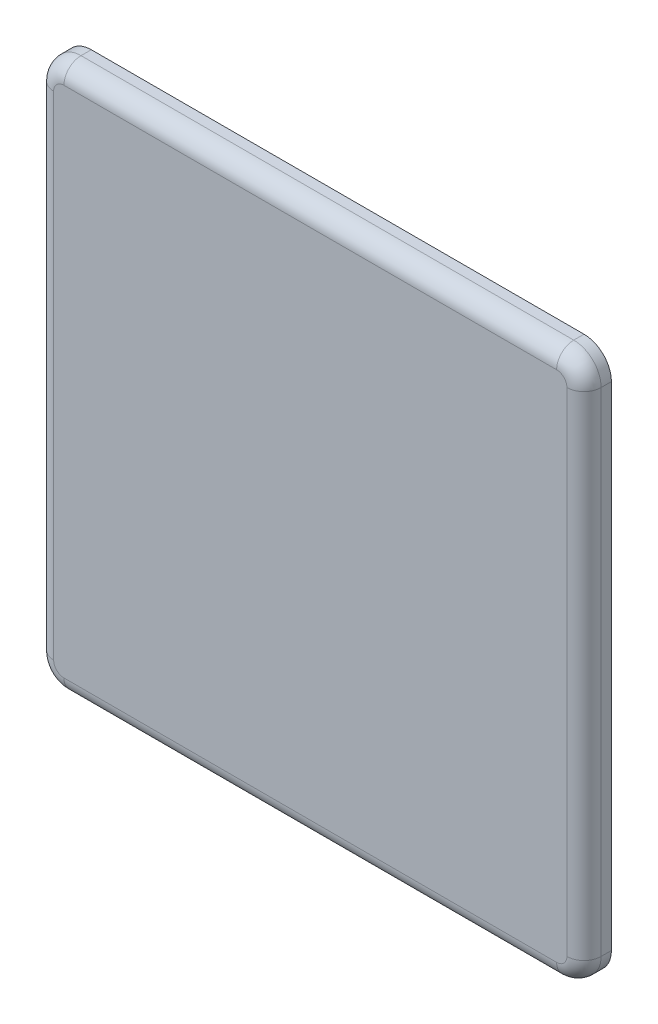
ISO-10303-21;
HEADER;
FILE_DESCRIPTION(('STEP AP214'),'2;1');
FILE_NAME('part.step','',(''),(''),'','','');
FILE_SCHEMA(('AUTOMOTIVE_DESIGN { 1 0 10303 214 1 1 1 1 }'));
ENDSEC;
DATA;
#1=APPLICATION_CONTEXT('core data for automotive mechanical design processes');
#2=APPLICATION_PROTOCOL_DEFINITION('international standard','automotive_design',2000,#1);
#3=PRODUCT_CONTEXT('',#1,'mechanical');
#4=PRODUCT('Part','Part','',(#3));
#5=PRODUCT_RELATED_PRODUCT_CATEGORY('part','',(#4));
#6=PRODUCT_DEFINITION_FORMATION('','',#4);
#7=PRODUCT_DEFINITION_CONTEXT('part definition',#1,'design');
#8=PRODUCT_DEFINITION('design','',#6,#7);
#9=PRODUCT_DEFINITION_SHAPE('','',#8);
#10=(LENGTH_UNIT() NAMED_UNIT(*) SI_UNIT(.MILLI.,.METRE.));
#11=(NAMED_UNIT(*) PLANE_ANGLE_UNIT() SI_UNIT($,.RADIAN.));
#12=(NAMED_UNIT(*) SI_UNIT($,.STERADIAN.) SOLID_ANGLE_UNIT());
#13=UNCERTAINTY_MEASURE_WITH_UNIT(LENGTH_MEASURE(1.E-05),#10,'distance_accuracy_value','');
#14=(GEOMETRIC_REPRESENTATION_CONTEXT(3) GLOBAL_UNCERTAINTY_ASSIGNED_CONTEXT((#13)) GLOBAL_UNIT_ASSIGNED_CONTEXT((#10,
#11,#12)) REPRESENTATION_CONTEXT('',''));
#15=CARTESIAN_POINT('',(0.,0.,0.));
#16=DIRECTION('',(0.,0.,1.));
#17=DIRECTION('',(1.,0.,0.));
#18=AXIS2_PLACEMENT_3D('',#15,#16,#17);
#19=CARTESIAN_POINT('',(40.,-40.,1766.));
#20=DIRECTION('',(0.,0.,1.));
#21=DIRECTION('',(1.,0.,0.));
#22=AXIS2_PLACEMENT_3D('',#19,#20,#21);
#23=PLANE('',#22);
#24=CARTESIAN_POINT('',(4.,-76.,1766.));
#25=DIRECTION('',(0.,0.,1.));
#26=DIRECTION('',(-1.,0.,0.));
#27=AXIS2_PLACEMENT_3D('',#24,#25,#26);
#28=CIRCLE('',#27,4.);
#29=CARTESIAN_POINT('',(0.,-76.,1766.));
#30=VERTEX_POINT('',#29);
#31=CARTESIAN_POINT('',(4.,-80.,1766.));
#32=VERTEX_POINT('',#31);
#33=EDGE_CURVE('E228',#30,#32,#28,.T.);
#34=ORIENTED_EDGE('',*,*,#33,.F.);
#35=DIRECTION('',(0.,-1.,0.));
#36=VECTOR('',#35,1.);
#37=CARTESIAN_POINT('',(0.,-4.,1766.));
#38=LINE('',#37,#36);
#39=CARTESIAN_POINT('',(0.,-4.,1766.));
#40=VERTEX_POINT('',#39);
#41=EDGE_CURVE('E28',#40,#30,#38,.T.);
#42=ORIENTED_EDGE('',*,*,#41,.F.);
#43=CARTESIAN_POINT('',(4.,-4.,1766.));
#44=DIRECTION('',(0.,0.,1.));
#45=DIRECTION('',(0.,1.,0.));
#46=AXIS2_PLACEMENT_3D('',#43,#44,#45);
#47=CIRCLE('',#46,4.);
#48=CARTESIAN_POINT('',(4.,0.,1766.));
#49=VERTEX_POINT('',#48);
#50=EDGE_CURVE('E192',#49,#40,#47,.T.);
#51=ORIENTED_EDGE('',*,*,#50,.F.);
#52=DIRECTION('',(-1.,0.,0.));
#53=VECTOR('',#52,1.);
#54=CARTESIAN_POINT('',(76.,0.,1766.));
#55=LINE('',#54,#53);
#56=CARTESIAN_POINT('',(76.,0.,1766.));
#57=VERTEX_POINT('',#56);
#58=EDGE_CURVE('E200',#57,#49,#55,.T.);
#59=ORIENTED_EDGE('',*,*,#58,.F.);
#60=CARTESIAN_POINT('',(76.,-4.,1766.));
#61=DIRECTION('',(0.,0.,1.));
#62=DIRECTION('',(1.,0.,0.));
#63=AXIS2_PLACEMENT_3D('',#60,#61,#62);
#64=CIRCLE('',#63,4.);
#65=CARTESIAN_POINT('',(80.,-4.,1766.));
#66=VERTEX_POINT('',#65);
#67=EDGE_CURVE('E209',#66,#57,#64,.T.);
#68=ORIENTED_EDGE('',*,*,#67,.F.);
#69=DIRECTION('',(0.,1.,0.));
#70=VECTOR('',#69,1.);
#71=CARTESIAN_POINT('',(80.,-76.,1766.));
#72=LINE('',#71,#70);
#73=CARTESIAN_POINT('',(80.,-76.,1766.));
#74=VERTEX_POINT('',#73);
#75=EDGE_CURVE('E11',#74,#66,#72,.T.);
#76=ORIENTED_EDGE('',*,*,#75,.F.);
#77=CARTESIAN_POINT('',(76.,-76.,1766.));
#78=DIRECTION('',(0.,0.,1.));
#79=DIRECTION('',(0.,-1.,0.));
#80=AXIS2_PLACEMENT_3D('',#77,#78,#79);
#81=CIRCLE('',#80,4.);
#82=CARTESIAN_POINT('',(76.,-80.,1766.));
#83=VERTEX_POINT('',#82);
#84=EDGE_CURVE('E236',#83,#74,#81,.T.);
#85=ORIENTED_EDGE('',*,*,#84,.F.);
#86=DIRECTION('',(1.,0.,0.));
#87=VECTOR('',#86,1.);
#88=CARTESIAN_POINT('',(4.,-80.,1766.));
#89=LINE('',#88,#87);
#90=EDGE_CURVE('E149',#32,#83,#89,.T.);
#91=ORIENTED_EDGE('',*,*,#90,.F.);
#92=EDGE_LOOP('',(#34,#42,#51,#59,#68,#76,#85,#91));
#93=FACE_BOUND('',#92,.T.);
#94=ADVANCED_FACE('F17',(#93),#23,.F.);
#95=CARTESIAN_POINT('',(80.,-40.,1766.));
#96=DIRECTION('',(1.,0.,0.));
#97=DIRECTION('',(0.,1.,0.));
#98=AXIS2_PLACEMENT_3D('',#95,#96,#97);
#99=PLANE('',#98);
#100=DIRECTION('',(0.,-1.,0.));
#101=VECTOR('',#100,1.);
#102=CARTESIAN_POINT('',(80.,-19.,1767.5));
#103=LINE('',#102,#101);
#104=CARTESIAN_POINT('',(80.,-4.,1767.5));
#105=VERTEX_POINT('',#104);
#106=CARTESIAN_POINT('',(80.,-76.,1767.5));
#107=VERTEX_POINT('',#106);
#108=EDGE_CURVE('E173',#105,#107,#103,.T.);
#109=ORIENTED_EDGE('',*,*,#108,.T.);
#110=DIRECTION('',(0.,0.,1.));
#111=VECTOR('',#110,1.);
#112=CARTESIAN_POINT('',(80.,-76.,1766.));
#113=LINE('',#112,#111);
#114=EDGE_CURVE('E212',#74,#107,#113,.T.);
#115=ORIENTED_EDGE('',*,*,#114,.F.);
#116=ORIENTED_EDGE('',*,*,#75,.T.);
#117=DIRECTION('',(0.,0.,1.));
#118=VECTOR('',#117,1.);
#119=CARTESIAN_POINT('',(80.,-4.,1766.));
#120=LINE('',#119,#118);
#121=EDGE_CURVE('E257',#66,#105,#120,.T.);
#122=ORIENTED_EDGE('',*,*,#121,.T.);
#123=EDGE_LOOP('',(#109,#115,#116,#122));
#124=FACE_BOUND('',#123,.T.);
#125=ADVANCED_FACE('F300',(#124),#99,.T.);
#126=CARTESIAN_POINT('',(0.,-40.,1766.));
#127=DIRECTION('',(-1.,0.,0.));
#128=DIRECTION('',(0.,0.,1.));
#129=AXIS2_PLACEMENT_3D('',#126,#127,#128);
#130=PLANE('',#129);
#131=DIRECTION('',(0.,1.,0.));
#132=VECTOR('',#131,1.);
#133=CARTESIAN_POINT('',(0.,-61.,1767.5));
#134=LINE('',#133,#132);
#135=CARTESIAN_POINT('',(0.,-76.,1767.5));
#136=VERTEX_POINT('',#135);
#137=CARTESIAN_POINT('',(0.,-4.,1767.5));
#138=VERTEX_POINT('',#137);
#139=EDGE_CURVE('E111',#136,#138,#134,.T.);
#140=ORIENTED_EDGE('',*,*,#139,.T.);
#141=DIRECTION('',(0.,0.,1.));
#142=VECTOR('',#141,1.);
#143=CARTESIAN_POINT('',(0.,-4.,1766.));
#144=LINE('',#143,#142);
#145=EDGE_CURVE('E196',#40,#138,#144,.T.);
#146=ORIENTED_EDGE('',*,*,#145,.F.);
#147=ORIENTED_EDGE('',*,*,#41,.T.);
#148=DIRECTION('',(0.,0.,1.));
#149=VECTOR('',#148,1.);
#150=CARTESIAN_POINT('',(0.,-76.,1766.));
#151=LINE('',#150,#149);
#152=EDGE_CURVE('E233',#30,#136,#151,.T.);
#153=ORIENTED_EDGE('',*,*,#152,.T.);
#154=EDGE_LOOP('',(#140,#146,#147,#153));
#155=FACE_BOUND('',#154,.T.);
#156=ADVANCED_FACE('F324',(#155),#130,.T.);
#157=CARTESIAN_POINT('',(40.,0.,1766.));
#158=DIRECTION('',(0.,1.,0.));
#159=DIRECTION('',(1.,0.,0.));
#160=AXIS2_PLACEMENT_3D('',#157,#158,#159);
#161=PLANE('',#160);
#162=DIRECTION('',(1.,0.,0.));
#163=VECTOR('',#162,1.);
#164=CARTESIAN_POINT('',(61.,0.,1767.5));
#165=LINE('',#164,#163);
#166=CARTESIAN_POINT('',(4.,0.,1767.5));
#167=VERTEX_POINT('',#166);
#168=CARTESIAN_POINT('',(76.,0.,1767.5));
#169=VERTEX_POINT('',#168);
#170=EDGE_CURVE('E150',#167,#169,#165,.T.);
#171=ORIENTED_EDGE('',*,*,#170,.T.);
#172=DIRECTION('',(0.,0.,1.));
#173=VECTOR('',#172,1.);
#174=CARTESIAN_POINT('',(76.,0.,1766.));
#175=LINE('',#174,#173);
#176=EDGE_CURVE('E205',#57,#169,#175,.T.);
#177=ORIENTED_EDGE('',*,*,#176,.F.);
#178=ORIENTED_EDGE('',*,*,#58,.T.);
#179=DIRECTION('',(0.,0.,1.));
#180=VECTOR('',#179,1.);
#181=CARTESIAN_POINT('',(4.,0.,1766.));
#182=LINE('',#181,#180);
#183=EDGE_CURVE('E197',#49,#167,#182,.T.);
#184=ORIENTED_EDGE('',*,*,#183,.T.);
#185=EDGE_LOOP('',(#171,#177,#178,#184));
#186=FACE_BOUND('',#185,.T.);
#187=ADVANCED_FACE('F334',(#186),#161,.T.);
#188=CARTESIAN_POINT('',(40.,-80.,1766.));
#189=DIRECTION('',(0.,-1.,0.));
#190=DIRECTION('',(0.,0.,-1.));
#191=AXIS2_PLACEMENT_3D('',#188,#189,#190);
#192=PLANE('',#191);
#193=DIRECTION('',(-1.,0.,0.));
#194=VECTOR('',#193,1.);
#195=CARTESIAN_POINT('',(19.,-80.,1767.5));
#196=LINE('',#195,#194);
#197=CARTESIAN_POINT('',(76.,-80.,1767.5));
#198=VERTEX_POINT('',#197);
#199=CARTESIAN_POINT('',(4.,-80.,1767.5));
#200=VERTEX_POINT('',#199);
#201=EDGE_CURVE('E170',#198,#200,#196,.T.);
#202=ORIENTED_EDGE('',*,*,#201,.T.);
#203=DIRECTION('',(0.,0.,1.));
#204=VECTOR('',#203,1.);
#205=CARTESIAN_POINT('',(4.,-80.,1766.));
#206=LINE('',#205,#204);
#207=EDGE_CURVE('E232',#32,#200,#206,.T.);
#208=ORIENTED_EDGE('',*,*,#207,.F.);
#209=ORIENTED_EDGE('',*,*,#90,.T.);
#210=DIRECTION('',(0.,0.,1.));
#211=VECTOR('',#210,1.);
#212=CARTESIAN_POINT('',(76.,-80.,1766.));
#213=LINE('',#212,#211);
#214=EDGE_CURVE('E227',#83,#198,#213,.T.);
#215=ORIENTED_EDGE('',*,*,#214,.T.);
#216=EDGE_LOOP('',(#202,#208,#209,#215));
#217=FACE_BOUND('',#216,.T.);
#218=ADVANCED_FACE('F19',(#217),#192,.T.);
#219=CARTESIAN_POINT('',(40.,-40.,1770.));
#220=DIRECTION('',(0.,0.,1.));
#221=DIRECTION('',(1.,0.,0.));
#222=AXIS2_PLACEMENT_3D('',#219,#220,#221);
#223=PLANE('',#222);
#224=CARTESIAN_POINT('',(4.,-76.,1770.));
#225=DIRECTION('',(0.,0.,1.));
#226=DIRECTION('',(-1.,0.,0.));
#227=AXIS2_PLACEMENT_3D('',#224,#225,#226);
#228=CIRCLE('',#227,1.5);
#229=CARTESIAN_POINT('',(2.5,-76.,1770.));
#230=VERTEX_POINT('',#229);
#231=CARTESIAN_POINT('',(4.,-77.5,1770.));
#232=VERTEX_POINT('',#231);
#233=EDGE_CURVE('E268',#230,#232,#228,.T.);
#234=ORIENTED_EDGE('',*,*,#233,.T.);
#235=DIRECTION('',(1.,0.,0.));
#236=VECTOR('',#235,1.);
#237=CARTESIAN_POINT('',(19.,-77.5,1770.));
#238=LINE('',#237,#236);
#239=CARTESIAN_POINT('',(76.,-77.5,1770.));
#240=VERTEX_POINT('',#239);
#241=EDGE_CURVE('E21',#232,#240,#238,.T.);
#242=ORIENTED_EDGE('',*,*,#241,.T.);
#243=CARTESIAN_POINT('',(76.,-76.,1770.));
#244=DIRECTION('',(0.,0.,1.));
#245=DIRECTION('',(0.,-1.,0.));
#246=AXIS2_PLACEMENT_3D('',#243,#244,#245);
#247=CIRCLE('',#246,1.5);
#248=CARTESIAN_POINT('',(77.5,-76.,1770.));
#249=VERTEX_POINT('',#248);
#250=EDGE_CURVE('E176',#240,#249,#247,.T.);
#251=ORIENTED_EDGE('',*,*,#250,.T.);
#252=DIRECTION('',(0.,1.,0.));
#253=VECTOR('',#252,1.);
#254=CARTESIAN_POINT('',(77.5,-19.,1770.));
#255=LINE('',#254,#253);
#256=CARTESIAN_POINT('',(77.5,-4.,1770.));
#257=VERTEX_POINT('',#256);
#258=EDGE_CURVE('E204',#249,#257,#255,.T.);
#259=ORIENTED_EDGE('',*,*,#258,.T.);
#260=CARTESIAN_POINT('',(76.,-4.,1770.));
#261=DIRECTION('',(0.,0.,1.));
#262=DIRECTION('',(1.,0.,0.));
#263=AXIS2_PLACEMENT_3D('',#260,#261,#262);
#264=CIRCLE('',#263,1.5);
#265=CARTESIAN_POINT('',(76.,-2.5,1770.));
#266=VERTEX_POINT('',#265);
#267=EDGE_CURVE('E144',#257,#266,#264,.T.);
#268=ORIENTED_EDGE('',*,*,#267,.T.);
#269=DIRECTION('',(-1.,0.,0.));
#270=VECTOR('',#269,1.);
#271=CARTESIAN_POINT('',(61.,-2.5,1770.));
#272=LINE('',#271,#270);
#273=CARTESIAN_POINT('',(4.,-2.5,1770.));
#274=VERTEX_POINT('',#273);
#275=EDGE_CURVE('E135',#266,#274,#272,.T.);
#276=ORIENTED_EDGE('',*,*,#275,.T.);
#277=CARTESIAN_POINT('',(4.,-4.,1770.));
#278=DIRECTION('',(0.,0.,1.));
#279=DIRECTION('',(0.,1.,0.));
#280=AXIS2_PLACEMENT_3D('',#277,#278,#279);
#281=CIRCLE('',#280,1.5);
#282=CARTESIAN_POINT('',(2.5,-4.,1770.));
#283=VERTEX_POINT('',#282);
#284=EDGE_CURVE('E140',#274,#283,#281,.T.);
#285=ORIENTED_EDGE('',*,*,#284,.T.);
#286=DIRECTION('',(0.,-1.,0.));
#287=VECTOR('',#286,1.);
#288=CARTESIAN_POINT('',(2.5,-61.,1770.));
#289=LINE('',#288,#287);
#290=EDGE_CURVE('E184',#283,#230,#289,.T.);
#291=ORIENTED_EDGE('',*,*,#290,.T.);
#292=EDGE_LOOP('',(#234,#242,#251,#259,#268,#276,#285,#291));
#293=FACE_BOUND('',#292,.T.);
#294=ADVANCED_FACE('F138',(#293),#223,.T.);
#295=CARTESIAN_POINT('',(82.,-2.5,1767.5));
#296=DIRECTION('',(-1.,0.,0.));
#297=DIRECTION('',(0.,0.,1.));
#298=AXIS2_PLACEMENT_3D('',#295,#296,#297);
#299=CYLINDRICAL_SURFACE('',#298,2.5);
#300=CARTESIAN_POINT('',(76.,-2.5,1767.5));
#301=DIRECTION('',(-1.,0.,0.));
#302=DIRECTION('',(0.,1.,0.));
#303=AXIS2_PLACEMENT_3D('',#300,#301,#302);
#304=CIRCLE('',#303,2.5);
#305=EDGE_CURVE('E181',#266,#169,#304,.T.);
#306=ORIENTED_EDGE('',*,*,#305,.T.);
#307=ORIENTED_EDGE('',*,*,#170,.F.);
#308=CARTESIAN_POINT('',(4.,-2.5,1767.5));
#309=DIRECTION('',(-1.,0.,0.));
#310=DIRECTION('',(0.,1.,0.));
#311=AXIS2_PLACEMENT_3D('',#308,#309,#310);
#312=CIRCLE('',#311,2.5);
#313=EDGE_CURVE('E153',#274,#167,#312,.T.);
#314=ORIENTED_EDGE('',*,*,#313,.F.);
#315=ORIENTED_EDGE('',*,*,#275,.F.);
#316=EDGE_LOOP('',(#306,#307,#314,#315));
#317=FACE_BOUND('',#316,.T.);
#318=ADVANCED_FACE('F154',(#317),#299,.T.);
#319=CARTESIAN_POINT('',(4.,-4.,1766.));
#320=DIRECTION('',(0.,0.,1.));
#321=DIRECTION('',(0.,1.,0.));
#322=AXIS2_PLACEMENT_3D('',#319,#320,#321);
#323=CYLINDRICAL_SURFACE('',#322,4.);
#324=CARTESIAN_POINT('',(4.,-4.,1767.5));
#325=DIRECTION('',(0.,0.,-1.));
#326=DIRECTION('',(0.,1.,0.));
#327=AXIS2_PLACEMENT_3D('',#324,#325,#326);
#328=CIRCLE('',#327,4.);
#329=EDGE_CURVE('E159',#138,#167,#328,.T.);
#330=ORIENTED_EDGE('',*,*,#329,.T.);
#331=ORIENTED_EDGE('',*,*,#183,.F.);
#332=ORIENTED_EDGE('',*,*,#50,.T.);
#333=ORIENTED_EDGE('',*,*,#145,.T.);
#334=EDGE_LOOP('',(#330,#331,#332,#333));
#335=FACE_BOUND('',#334,.T.);
#336=ADVANCED_FACE('F387',(#335),#323,.T.);
#337=CARTESIAN_POINT('',(4.,-4.,1767.5));
#338=DIRECTION('',(0.,0.,1.));
#339=DIRECTION('',(0.,1.,0.));
#340=AXIS2_PLACEMENT_3D('',#337,#338,#339);
#341=DEGENERATE_TOROIDAL_SURFACE('',#340,1.5,2.5,.T.);
#342=CARTESIAN_POINT('',(2.5,-4.,1767.5));
#343=DIRECTION('',(0.,-1.,0.));
#344=DIRECTION('',(-1.,0.,0.));
#345=AXIS2_PLACEMENT_3D('',#342,#343,#344);
#346=CIRCLE('',#345,2.5);
#347=EDGE_CURVE('E162',#283,#138,#346,.T.);
#348=ORIENTED_EDGE('',*,*,#347,.F.);
#349=ORIENTED_EDGE('',*,*,#284,.F.);
#350=ORIENTED_EDGE('',*,*,#313,.T.);
#351=ORIENTED_EDGE('',*,*,#329,.F.);
#352=EDGE_LOOP('',(#348,#349,#350,#351));
#353=FACE_BOUND('',#352,.T.);
#354=ADVANCED_FACE('F161',(#353),#341,.T.);
#355=CARTESIAN_POINT('',(-2.,-77.5,1767.5));
#356=DIRECTION('',(1.,0.,0.));
#357=DIRECTION('',(0.,0.,1.));
#358=AXIS2_PLACEMENT_3D('',#355,#356,#357);
#359=CYLINDRICAL_SURFACE('',#358,2.5);
#360=CARTESIAN_POINT('',(4.,-77.5,1767.5));
#361=DIRECTION('',(1.,0.,0.));
#362=DIRECTION('',(0.,-1.,0.));
#363=AXIS2_PLACEMENT_3D('',#360,#361,#362);
#364=CIRCLE('',#363,2.5);
#365=EDGE_CURVE('E264',#232,#200,#364,.T.);
#366=ORIENTED_EDGE('',*,*,#365,.T.);
#367=ORIENTED_EDGE('',*,*,#201,.F.);
#368=CARTESIAN_POINT('',(76.,-77.5,1767.5));
#369=DIRECTION('',(1.,0.,0.));
#370=DIRECTION('',(0.,-1.,0.));
#371=AXIS2_PLACEMENT_3D('',#368,#369,#370);
#372=CIRCLE('',#371,2.5);
#373=EDGE_CURVE('E187',#240,#198,#372,.T.);
#374=ORIENTED_EDGE('',*,*,#373,.F.);
#375=ORIENTED_EDGE('',*,*,#241,.F.);
#376=EDGE_LOOP('',(#366,#367,#374,#375));
#377=FACE_BOUND('',#376,.T.);
#378=ADVANCED_FACE('F315',(#377),#359,.T.);
#379=CARTESIAN_POINT('',(76.,-76.,1766.));
#380=DIRECTION('',(0.,0.,1.));
#381=DIRECTION('',(0.,-1.,0.));
#382=AXIS2_PLACEMENT_3D('',#379,#380,#381);
#383=CYLINDRICAL_SURFACE('',#382,4.);
#384=CARTESIAN_POINT('',(76.,-76.,1767.5));
#385=DIRECTION('',(0.,0.,-1.));
#386=DIRECTION('',(0.,-1.,0.));
#387=AXIS2_PLACEMENT_3D('',#384,#385,#386);
#388=CIRCLE('',#387,4.);
#389=EDGE_CURVE('E191',#107,#198,#388,.T.);
#390=ORIENTED_EDGE('',*,*,#389,.T.);
#391=ORIENTED_EDGE('',*,*,#214,.F.);
#392=ORIENTED_EDGE('',*,*,#84,.T.);
#393=ORIENTED_EDGE('',*,*,#114,.T.);
#394=EDGE_LOOP('',(#390,#391,#392,#393));
#395=FACE_BOUND('',#394,.T.);
#396=ADVANCED_FACE('F293',(#395),#383,.T.);
#397=CARTESIAN_POINT('',(76.,-76.,1767.5));
#398=DIRECTION('',(0.,0.,1.));
#399=DIRECTION('',(0.,-1.,0.));
#400=AXIS2_PLACEMENT_3D('',#397,#398,#399);
#401=DEGENERATE_TOROIDAL_SURFACE('',#400,1.5,2.5,.T.);
#402=CARTESIAN_POINT('',(77.5,-76.,1767.5));
#403=DIRECTION('',(0.,1.,0.));
#404=DIRECTION('',(1.,0.,0.));
#405=AXIS2_PLACEMENT_3D('',#402,#403,#404);
#406=CIRCLE('',#405,2.5);
#407=EDGE_CURVE('E177',#249,#107,#406,.T.);
#408=ORIENTED_EDGE('',*,*,#407,.F.);
#409=ORIENTED_EDGE('',*,*,#250,.F.);
#410=ORIENTED_EDGE('',*,*,#373,.T.);
#411=ORIENTED_EDGE('',*,*,#389,.F.);
#412=EDGE_LOOP('',(#408,#409,#410,#411));
#413=FACE_BOUND('',#412,.T.);
#414=ADVANCED_FACE('F309',(#413),#401,.T.);
#415=CARTESIAN_POINT('',(77.5,2.,1767.5));
#416=DIRECTION('',(0.,-1.,0.));
#417=DIRECTION('',(1.,0.,0.));
#418=AXIS2_PLACEMENT_3D('',#415,#416,#417);
#419=CYLINDRICAL_SURFACE('',#418,2.5);
#420=CARTESIAN_POINT('',(77.5,-4.,1767.5));
#421=DIRECTION('',(0.,1.,0.));
#422=DIRECTION('',(1.,0.,0.));
#423=AXIS2_PLACEMENT_3D('',#420,#421,#422);
#424=CIRCLE('',#423,2.5);
#425=EDGE_CURVE('E180',#257,#105,#424,.T.);
#426=ORIENTED_EDGE('',*,*,#425,.F.);
#427=ORIENTED_EDGE('',*,*,#258,.F.);
#428=ORIENTED_EDGE('',*,*,#407,.T.);
#429=ORIENTED_EDGE('',*,*,#108,.F.);
#430=EDGE_LOOP('',(#426,#427,#428,#429));
#431=FACE_BOUND('',#430,.T.);
#432=ADVANCED_FACE('F306',(#431),#419,.T.);
#433=CARTESIAN_POINT('',(76.,-4.,1766.));
#434=DIRECTION('',(0.,0.,1.));
#435=DIRECTION('',(1.,0.,0.));
#436=AXIS2_PLACEMENT_3D('',#433,#434,#435);
#437=CYLINDRICAL_SURFACE('',#436,4.);
#438=CARTESIAN_POINT('',(76.,-4.,1767.5));
#439=DIRECTION('',(0.,0.,-1.));
#440=DIRECTION('',(1.,0.,0.));
#441=AXIS2_PLACEMENT_3D('',#438,#439,#440);
#442=CIRCLE('',#441,4.);
#443=EDGE_CURVE('E251',#169,#105,#442,.T.);
#444=ORIENTED_EDGE('',*,*,#443,.T.);
#445=ORIENTED_EDGE('',*,*,#121,.F.);
#446=ORIENTED_EDGE('',*,*,#67,.T.);
#447=ORIENTED_EDGE('',*,*,#176,.T.);
#448=EDGE_LOOP('',(#444,#445,#446,#447));
#449=FACE_BOUND('',#448,.T.);
#450=ADVANCED_FACE('F367',(#449),#437,.T.);
#451=CARTESIAN_POINT('',(76.,-4.,1767.5));
#452=DIRECTION('',(0.,0.,1.));
#453=DIRECTION('',(1.,0.,0.));
#454=AXIS2_PLACEMENT_3D('',#451,#452,#453);
#455=DEGENERATE_TOROIDAL_SURFACE('',#454,1.5,2.5,.T.);
#456=ORIENTED_EDGE('',*,*,#305,.F.);
#457=ORIENTED_EDGE('',*,*,#267,.F.);
#458=ORIENTED_EDGE('',*,*,#425,.T.);
#459=ORIENTED_EDGE('',*,*,#443,.F.);
#460=EDGE_LOOP('',(#456,#457,#458,#459));
#461=FACE_BOUND('',#460,.T.);
#462=ADVANCED_FACE('F371',(#461),#455,.T.);
#463=CARTESIAN_POINT('',(2.5,-82.,1767.5));
#464=DIRECTION('',(0.,1.,0.));
#465=DIRECTION('',(-1.,0.,0.));
#466=AXIS2_PLACEMENT_3D('',#463,#464,#465);
#467=CYLINDRICAL_SURFACE('',#466,2.5);
#468=CARTESIAN_POINT('',(2.5,-76.,1767.5));
#469=DIRECTION('',(0.,-1.,0.));
#470=DIRECTION('',(-1.,0.,0.));
#471=AXIS2_PLACEMENT_3D('',#468,#469,#470);
#472=CIRCLE('',#471,2.5);
#473=EDGE_CURVE('E263',#230,#136,#472,.T.);
#474=ORIENTED_EDGE('',*,*,#473,.F.);
#475=ORIENTED_EDGE('',*,*,#290,.F.);
#476=ORIENTED_EDGE('',*,*,#347,.T.);
#477=ORIENTED_EDGE('',*,*,#139,.F.);
#478=EDGE_LOOP('',(#474,#475,#476,#477));
#479=FACE_BOUND('',#478,.T.);
#480=ADVANCED_FACE('F325',(#479),#467,.T.);
#481=CARTESIAN_POINT('',(4.,-76.,1766.));
#482=DIRECTION('',(0.,0.,1.));
#483=DIRECTION('',(-1.,0.,0.));
#484=AXIS2_PLACEMENT_3D('',#481,#482,#483);
#485=CYLINDRICAL_SURFACE('',#484,4.);
#486=CARTESIAN_POINT('',(4.,-76.,1767.5));
#487=DIRECTION('',(0.,0.,-1.));
#488=DIRECTION('',(-1.,0.,0.));
#489=AXIS2_PLACEMENT_3D('',#486,#487,#488);
#490=CIRCLE('',#489,4.);
#491=EDGE_CURVE('E240',#200,#136,#490,.T.);
#492=ORIENTED_EDGE('',*,*,#491,.T.);
#493=ORIENTED_EDGE('',*,*,#152,.F.);
#494=ORIENTED_EDGE('',*,*,#33,.T.);
#495=ORIENTED_EDGE('',*,*,#207,.T.);
#496=EDGE_LOOP('',(#492,#493,#494,#495));
#497=FACE_BOUND('',#496,.T.);
#498=ADVANCED_FACE('F323',(#497),#485,.T.);
#499=CARTESIAN_POINT('',(4.,-76.,1767.5));
#500=DIRECTION('',(0.,0.,1.));
#501=DIRECTION('',(-1.,0.,0.));
#502=AXIS2_PLACEMENT_3D('',#499,#500,#501);
#503=DEGENERATE_TOROIDAL_SURFACE('',#502,1.5,2.5,.T.);
#504=ORIENTED_EDGE('',*,*,#365,.F.);
#505=ORIENTED_EDGE('',*,*,#233,.F.);
#506=ORIENTED_EDGE('',*,*,#473,.T.);
#507=ORIENTED_EDGE('',*,*,#491,.F.);
#508=EDGE_LOOP('',(#504,#505,#506,#507));
#509=FACE_BOUND('',#508,.T.);
#510=ADVANCED_FACE('F359',(#509),#503,.T.);
#511=CLOSED_SHELL('',(#94,#125,#156,#187,#218,#294,#318,#336,#354,#378,#396,#414,#432,#450,#462,
#480,#498,#510));
#512=MANIFOLD_SOLID_BREP('B1',#511);
#513=ADVANCED_BREP_SHAPE_REPRESENTATION('',(#18,#512),#14);
#514=SHAPE_DEFINITION_REPRESENTATION(#9,#513);
ENDSEC;
END-ISO-10303-21;
